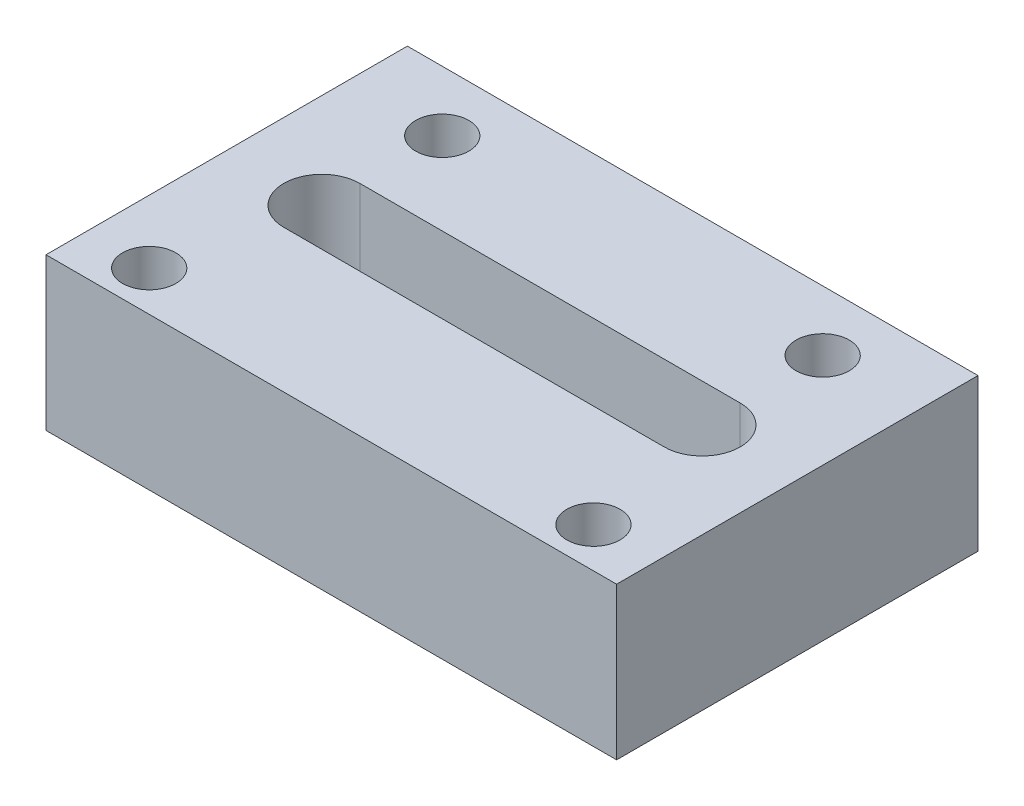
ISO-10303-21;
HEADER;
FILE_DESCRIPTION(('STEP AP214'),'2;1');
FILE_NAME('part.step','',(''),(''),'','','');
FILE_SCHEMA(('AUTOMOTIVE_DESIGN { 1 0 10303 214 1 1 1 1 }'));
ENDSEC;
DATA;
#1=APPLICATION_CONTEXT('core data for automotive mechanical design processes');
#2=APPLICATION_PROTOCOL_DEFINITION('international standard','automotive_design',2000,#1);
#3=PRODUCT_CONTEXT('',#1,'mechanical');
#4=PRODUCT('Part','Part','',(#3));
#5=PRODUCT_RELATED_PRODUCT_CATEGORY('part','',(#4));
#6=PRODUCT_DEFINITION_FORMATION('','',#4);
#7=PRODUCT_DEFINITION_CONTEXT('part definition',#1,'design');
#8=PRODUCT_DEFINITION('design','',#6,#7);
#9=PRODUCT_DEFINITION_SHAPE('','',#8);
#10=(LENGTH_UNIT() NAMED_UNIT(*) SI_UNIT(.MILLI.,.METRE.));
#11=(NAMED_UNIT(*) PLANE_ANGLE_UNIT() SI_UNIT($,.RADIAN.));
#12=(NAMED_UNIT(*) SI_UNIT($,.STERADIAN.) SOLID_ANGLE_UNIT());
#13=UNCERTAINTY_MEASURE_WITH_UNIT(LENGTH_MEASURE(1.E-05),#10,'distance_accuracy_value','');
#14=(GEOMETRIC_REPRESENTATION_CONTEXT(3) GLOBAL_UNCERTAINTY_ASSIGNED_CONTEXT((#13)) GLOBAL_UNIT_ASSIGNED_CONTEXT((#10,
#11,#12)) REPRESENTATION_CONTEXT('',''));
#15=CARTESIAN_POINT('',(0.,0.,0.));
#16=DIRECTION('',(0.,0.,1.));
#17=DIRECTION('',(1.,0.,0.));
#18=AXIS2_PLACEMENT_3D('',#15,#16,#17);
#19=CARTESIAN_POINT('',(75.,-10.,-47.5));
#20=DIRECTION('',(1.,0.,0.));
#21=DIRECTION('',(0.,0.,-1.));
#22=AXIS2_PLACEMENT_3D('',#19,#20,#21);
#23=PLANE('',#22);
#24=DIRECTION('',(0.,1.,0.));
#25=VECTOR('',#24,1.);
#26=CARTESIAN_POINT('',(75.,-10.,-47.5));
#27=LINE('',#26,#25);
#28=CARTESIAN_POINT('',(75.,-10.,-47.5));
#29=VERTEX_POINT('',#28);
#30=CARTESIAN_POINT('',(75.,30.,-47.5));
#31=VERTEX_POINT('',#30);
#32=EDGE_CURVE('E36',#29,#31,#27,.T.);
#33=ORIENTED_EDGE('',*,*,#32,.T.);
#34=DIRECTION('',(0.,0.,-1.));
#35=VECTOR('',#34,1.);
#36=CARTESIAN_POINT('',(75.,30.,-47.5));
#37=LINE('',#36,#35);
#38=CARTESIAN_POINT('',(75.,30.,47.5));
#39=VERTEX_POINT('',#38);
#40=EDGE_CURVE('E131',#39,#31,#37,.T.);
#41=ORIENTED_EDGE('',*,*,#40,.F.);
#42=DIRECTION('',(0.,1.,0.));
#43=VECTOR('',#42,1.);
#44=CARTESIAN_POINT('',(75.,-10.,47.5));
#45=LINE('',#44,#43);
#46=CARTESIAN_POINT('',(75.,-10.,47.5));
#47=VERTEX_POINT('',#46);
#48=EDGE_CURVE('E11',#47,#39,#45,.T.);
#49=ORIENTED_EDGE('',*,*,#48,.F.);
#50=DIRECTION('',(0.,0.,-1.));
#51=VECTOR('',#50,1.);
#52=CARTESIAN_POINT('',(75.,-10.,-47.5));
#53=LINE('',#52,#51);
#54=EDGE_CURVE('E162',#47,#29,#53,.T.);
#55=ORIENTED_EDGE('',*,*,#54,.T.);
#56=EDGE_LOOP('',(#33,#41,#49,#55));
#57=FACE_BOUND('',#56,.T.);
#58=ADVANCED_FACE('F33',(#57),#23,.T.);
#59=CARTESIAN_POINT('',(-75.,-10.,47.5));
#60=DIRECTION('',(0.,0.,1.));
#61=DIRECTION('',(1.,0.,0.));
#62=AXIS2_PLACEMENT_3D('',#59,#60,#61);
#63=PLANE('',#62);
#64=ORIENTED_EDGE('',*,*,#48,.T.);
#65=DIRECTION('',(1.,0.,0.));
#66=VECTOR('',#65,1.);
#67=CARTESIAN_POINT('',(-75.,30.,47.5));
#68=LINE('',#67,#66);
#69=CARTESIAN_POINT('',(-75.,30.,47.5));
#70=VERTEX_POINT('',#69);
#71=EDGE_CURVE('E140',#70,#39,#68,.T.);
#72=ORIENTED_EDGE('',*,*,#71,.F.);
#73=DIRECTION('',(0.,1.,0.));
#74=VECTOR('',#73,1.);
#75=CARTESIAN_POINT('',(-75.,-10.,47.5));
#76=LINE('',#75,#74);
#77=CARTESIAN_POINT('',(-75.,-10.,47.5));
#78=VERTEX_POINT('',#77);
#79=EDGE_CURVE('E41',#78,#70,#76,.T.);
#80=ORIENTED_EDGE('',*,*,#79,.F.);
#81=DIRECTION('',(1.,0.,0.));
#82=VECTOR('',#81,1.);
#83=CARTESIAN_POINT('',(-75.,-10.,47.5));
#84=LINE('',#83,#82);
#85=EDGE_CURVE('E173',#78,#47,#84,.T.);
#86=ORIENTED_EDGE('',*,*,#85,.T.);
#87=EDGE_LOOP('',(#64,#72,#80,#86));
#88=FACE_BOUND('',#87,.T.);
#89=ADVANCED_FACE('F185',(#88),#63,.T.);
#90=CARTESIAN_POINT('',(-75.,-10.,-47.5));
#91=DIRECTION('',(-1.,0.,0.));
#92=DIRECTION('',(0.,0.,1.));
#93=AXIS2_PLACEMENT_3D('',#90,#91,#92);
#94=PLANE('',#93);
#95=ORIENTED_EDGE('',*,*,#79,.T.);
#96=DIRECTION('',(0.,0.,1.));
#97=VECTOR('',#96,1.);
#98=CARTESIAN_POINT('',(-75.,30.,-47.5));
#99=LINE('',#98,#97);
#100=CARTESIAN_POINT('',(-75.,30.,-47.5));
#101=VERTEX_POINT('',#100);
#102=EDGE_CURVE('E137',#101,#70,#99,.T.);
#103=ORIENTED_EDGE('',*,*,#102,.F.);
#104=DIRECTION('',(0.,1.,0.));
#105=VECTOR('',#104,1.);
#106=CARTESIAN_POINT('',(-75.,-10.,-47.5));
#107=LINE('',#106,#105);
#108=CARTESIAN_POINT('',(-75.,-10.,-47.5));
#109=VERTEX_POINT('',#108);
#110=EDGE_CURVE('E176',#109,#101,#107,.T.);
#111=ORIENTED_EDGE('',*,*,#110,.F.);
#112=DIRECTION('',(0.,0.,1.));
#113=VECTOR('',#112,1.);
#114=CARTESIAN_POINT('',(-75.,-10.,-47.5));
#115=LINE('',#114,#113);
#116=EDGE_CURVE('E170',#109,#78,#115,.T.);
#117=ORIENTED_EDGE('',*,*,#116,.T.);
#118=EDGE_LOOP('',(#95,#103,#111,#117));
#119=FACE_BOUND('',#118,.T.);
#120=ADVANCED_FACE('F191',(#119),#94,.T.);
#121=CARTESIAN_POINT('',(-75.,-10.,-47.5));
#122=DIRECTION('',(0.,0.,-1.));
#123=DIRECTION('',(-1.,0.,0.));
#124=AXIS2_PLACEMENT_3D('',#121,#122,#123);
#125=PLANE('',#124);
#126=ORIENTED_EDGE('',*,*,#110,.T.);
#127=DIRECTION('',(-1.,0.,0.));
#128=VECTOR('',#127,1.);
#129=CARTESIAN_POINT('',(-75.,30.,-47.5));
#130=LINE('',#129,#128);
#131=EDGE_CURVE('E134',#31,#101,#130,.T.);
#132=ORIENTED_EDGE('',*,*,#131,.F.);
#133=ORIENTED_EDGE('',*,*,#32,.F.);
#134=DIRECTION('',(-1.,0.,0.));
#135=VECTOR('',#134,1.);
#136=CARTESIAN_POINT('',(-75.,-10.,-47.5));
#137=LINE('',#136,#135);
#138=EDGE_CURVE('E167',#29,#109,#137,.T.);
#139=ORIENTED_EDGE('',*,*,#138,.T.);
#140=EDGE_LOOP('',(#126,#132,#133,#139));
#141=FACE_BOUND('',#140,.T.);
#142=ADVANCED_FACE('F180',(#141),#125,.T.);
#143=CARTESIAN_POINT('',(0.,-10.,0.));
#144=DIRECTION('',(0.,1.,0.));
#145=DIRECTION('',(0.,0.,1.));
#146=AXIS2_PLACEMENT_3D('',#143,#144,#145);
#147=PLANE('',#146);
#148=CARTESIAN_POINT('',(58.3891044371405,-10.,36.9797661435222));
#149=DIRECTION('',(0.,1.,0.));
#150=DIRECTION('',(0.,0.,1.));
#151=AXIS2_PLACEMENT_3D('',#148,#149,#150);
#152=CIRCLE('',#151,6.99999999999999);
#153=CARTESIAN_POINT('',(58.3891044371405,-10.,43.9797661435222));
#154=VERTEX_POINT('',#153);
#155=EDGE_CURVE('E143',#154,#154,#152,.T.);
#156=ORIENTED_EDGE('',*,*,#155,.T.);
#157=EDGE_LOOP('',(#156));
#158=FACE_BOUND('',#157,.T.);
#159=CARTESIAN_POINT('',(-58.3891044371403,-10.,36.9797661435222));
#160=DIRECTION('',(0.,1.,0.));
#161=DIRECTION('',(0.,0.,1.));
#162=AXIS2_PLACEMENT_3D('',#159,#160,#161);
#163=CIRCLE('',#162,7.);
#164=CARTESIAN_POINT('',(-58.3891044371403,-10.,43.9797661435222));
#165=VERTEX_POINT('',#164);
#166=EDGE_CURVE('E146',#165,#165,#163,.T.);
#167=ORIENTED_EDGE('',*,*,#166,.T.);
#168=EDGE_LOOP('',(#167));
#169=FACE_BOUND('',#168,.T.);
#170=CARTESIAN_POINT('',(50.,-10.,-31.6666666666667));
#171=DIRECTION('',(0.,1.,0.));
#172=DIRECTION('',(0.,0.,1.));
#173=AXIS2_PLACEMENT_3D('',#170,#171,#172);
#174=CIRCLE('',#173,7.);
#175=CARTESIAN_POINT('',(50.,-10.,-24.6666666666667));
#176=VERTEX_POINT('',#175);
#177=EDGE_CURVE('E149',#176,#176,#174,.T.);
#178=ORIENTED_EDGE('',*,*,#177,.T.);
#179=EDGE_LOOP('',(#178));
#180=FACE_BOUND('',#179,.T.);
#181=CARTESIAN_POINT('',(-50.,-10.,-31.6666666666667));
#182=DIRECTION('',(0.,1.,0.));
#183=DIRECTION('',(0.,0.,1.));
#184=AXIS2_PLACEMENT_3D('',#181,#182,#183);
#185=CIRCLE('',#184,7.);
#186=CARTESIAN_POINT('',(-50.,-10.,-24.6666666666667));
#187=VERTEX_POINT('',#186);
#188=EDGE_CURVE('E152',#187,#187,#185,.T.);
#189=ORIENTED_EDGE('',*,*,#188,.T.);
#190=EDGE_LOOP('',(#189));
#191=FACE_BOUND('',#190,.T.);
#192=DIRECTION('',(-1.,0.,0.));
#193=VECTOR('',#192,1.);
#194=CARTESIAN_POINT('',(-50.,-10.,-10.));
#195=LINE('',#194,#193);
#196=CARTESIAN_POINT('',(50.,-10.,-10.));
#197=VERTEX_POINT('',#196);
#198=CARTESIAN_POINT('',(-50.,-10.,-10.));
#199=VERTEX_POINT('',#198);
#200=EDGE_CURVE('E110',#197,#199,#195,.T.);
#201=ORIENTED_EDGE('',*,*,#200,.T.);
#202=CARTESIAN_POINT('',(-50.,-10.,0.));
#203=DIRECTION('',(0.,1.,0.));
#204=DIRECTION('',(0.,0.,1.));
#205=AXIS2_PLACEMENT_3D('',#202,#203,#204);
#206=CIRCLE('',#205,10.);
#207=CARTESIAN_POINT('',(-50.,-10.,10.));
#208=VERTEX_POINT('',#207);
#209=EDGE_CURVE('E155',#199,#208,#206,.T.);
#210=ORIENTED_EDGE('',*,*,#209,.T.);
#211=DIRECTION('',(1.,0.,0.));
#212=VECTOR('',#211,1.);
#213=CARTESIAN_POINT('',(-50.,-10.,10.));
#214=LINE('',#213,#212);
#215=CARTESIAN_POINT('',(50.,-10.,10.));
#216=VERTEX_POINT('',#215);
#217=EDGE_CURVE('E105',#208,#216,#214,.T.);
#218=ORIENTED_EDGE('',*,*,#217,.T.);
#219=CARTESIAN_POINT('',(50.,-10.,0.));
#220=DIRECTION('',(0.,1.,0.));
#221=DIRECTION('',(0.,0.,1.));
#222=AXIS2_PLACEMENT_3D('',#219,#220,#221);
#223=CIRCLE('',#222,10.);
#224=EDGE_CURVE('E49',#216,#197,#223,.T.);
#225=ORIENTED_EDGE('',*,*,#224,.T.);
#226=EDGE_LOOP('',(#201,#210,#218,#225));
#227=FACE_BOUND('',#226,.T.);
#228=ORIENTED_EDGE('',*,*,#54,.F.);
#229=ORIENTED_EDGE('',*,*,#85,.F.);
#230=ORIENTED_EDGE('',*,*,#116,.F.);
#231=ORIENTED_EDGE('',*,*,#138,.F.);
#232=EDGE_LOOP('',(#228,#229,#230,#231));
#233=FACE_BOUND('',#232,.T.);
#234=ADVANCED_FACE('F189',(#158,#169,#180,#191,#227,#233),#147,.F.);
#235=CARTESIAN_POINT('',(-50.,-10.,0.));
#236=DIRECTION('',(0.,1.,0.));
#237=DIRECTION('',(0.,0.,1.));
#238=AXIS2_PLACEMENT_3D('',#235,#236,#237);
#239=CYLINDRICAL_SURFACE('',#238,10.);
#240=DIRECTION('',(0.,1.,0.));
#241=VECTOR('',#240,1.);
#242=CARTESIAN_POINT('',(-50.,-10.,-10.));
#243=LINE('',#242,#241);
#244=CARTESIAN_POINT('',(-50.,30.,-10.));
#245=VERTEX_POINT('',#244);
#246=EDGE_CURVE('E115',#199,#245,#243,.T.);
#247=ORIENTED_EDGE('',*,*,#246,.T.);
#248=CARTESIAN_POINT('',(-50.,30.,0.));
#249=DIRECTION('',(0.,1.,0.));
#250=DIRECTION('',(0.,0.,1.));
#251=AXIS2_PLACEMENT_3D('',#248,#249,#250);
#252=CIRCLE('',#251,10.);
#253=CARTESIAN_POINT('',(-50.,30.,10.));
#254=VERTEX_POINT('',#253);
#255=EDGE_CURVE('E113',#245,#254,#252,.T.);
#256=ORIENTED_EDGE('',*,*,#255,.T.);
#257=DIRECTION('',(0.,1.,0.));
#258=VECTOR('',#257,1.);
#259=CARTESIAN_POINT('',(-50.,-10.,10.));
#260=LINE('',#259,#258);
#261=EDGE_CURVE('E98',#208,#254,#260,.T.);
#262=ORIENTED_EDGE('',*,*,#261,.F.);
#263=ORIENTED_EDGE('',*,*,#209,.F.);
#264=EDGE_LOOP('',(#247,#256,#262,#263));
#265=FACE_BOUND('',#264,.T.);
#266=ADVANCED_FACE('F114',(#265),#239,.F.);
#267=CARTESIAN_POINT('',(-50.,-10.,-10.));
#268=DIRECTION('',(0.,0.,-1.));
#269=DIRECTION('',(-1.,0.,0.));
#270=AXIS2_PLACEMENT_3D('',#267,#268,#269);
#271=PLANE('',#270);
#272=DIRECTION('',(0.,1.,0.));
#273=VECTOR('',#272,1.);
#274=CARTESIAN_POINT('',(50.,-10.,-10.));
#275=LINE('',#274,#273);
#276=CARTESIAN_POINT('',(50.,30.,-10.));
#277=VERTEX_POINT('',#276);
#278=EDGE_CURVE('E163',#197,#277,#275,.T.);
#279=ORIENTED_EDGE('',*,*,#278,.T.);
#280=DIRECTION('',(-1.,0.,0.));
#281=VECTOR('',#280,1.);
#282=CARTESIAN_POINT('',(-50.,30.,-10.));
#283=LINE('',#282,#281);
#284=EDGE_CURVE('E126',#277,#245,#283,.T.);
#285=ORIENTED_EDGE('',*,*,#284,.T.);
#286=ORIENTED_EDGE('',*,*,#246,.F.);
#287=ORIENTED_EDGE('',*,*,#200,.F.);
#288=EDGE_LOOP('',(#279,#285,#286,#287));
#289=FACE_BOUND('',#288,.T.);
#290=ADVANCED_FACE('F234',(#289),#271,.F.);
#291=CARTESIAN_POINT('',(50.,-10.,0.));
#292=DIRECTION('',(0.,1.,0.));
#293=DIRECTION('',(0.,0.,1.));
#294=AXIS2_PLACEMENT_3D('',#291,#292,#293);
#295=CYLINDRICAL_SURFACE('',#294,10.);
#296=DIRECTION('',(0.,1.,0.));
#297=VECTOR('',#296,1.);
#298=CARTESIAN_POINT('',(50.,-10.,10.));
#299=LINE('',#298,#297);
#300=CARTESIAN_POINT('',(50.,30.,10.));
#301=VERTEX_POINT('',#300);
#302=EDGE_CURVE('E109',#216,#301,#299,.T.);
#303=ORIENTED_EDGE('',*,*,#302,.T.);
#304=CARTESIAN_POINT('',(50.,30.,0.));
#305=DIRECTION('',(0.,1.,0.));
#306=DIRECTION('',(0.,0.,1.));
#307=AXIS2_PLACEMENT_3D('',#304,#305,#306);
#308=CIRCLE('',#307,10.);
#309=EDGE_CURVE('E124',#301,#277,#308,.T.);
#310=ORIENTED_EDGE('',*,*,#309,.T.);
#311=ORIENTED_EDGE('',*,*,#278,.F.);
#312=ORIENTED_EDGE('',*,*,#224,.F.);
#313=EDGE_LOOP('',(#303,#310,#311,#312));
#314=FACE_BOUND('',#313,.T.);
#315=ADVANCED_FACE('F243',(#314),#295,.F.);
#316=CARTESIAN_POINT('',(-50.,-10.,10.));
#317=DIRECTION('',(0.,0.,1.));
#318=DIRECTION('',(1.,0.,0.));
#319=AXIS2_PLACEMENT_3D('',#316,#317,#318);
#320=PLANE('',#319);
#321=ORIENTED_EDGE('',*,*,#261,.T.);
#322=DIRECTION('',(1.,0.,0.));
#323=VECTOR('',#322,1.);
#324=CARTESIAN_POINT('',(-50.,30.,10.));
#325=LINE('',#324,#323);
#326=EDGE_CURVE('E102',#254,#301,#325,.T.);
#327=ORIENTED_EDGE('',*,*,#326,.T.);
#328=ORIENTED_EDGE('',*,*,#302,.F.);
#329=ORIENTED_EDGE('',*,*,#217,.F.);
#330=EDGE_LOOP('',(#321,#327,#328,#329));
#331=FACE_BOUND('',#330,.T.);
#332=ADVANCED_FACE('F100',(#331),#320,.F.);
#333=CARTESIAN_POINT('',(-50.,-10.,-31.6666666666667));
#334=DIRECTION('',(0.,1.,0.));
#335=DIRECTION('',(0.,0.,1.));
#336=AXIS2_PLACEMENT_3D('',#333,#334,#335);
#337=CYLINDRICAL_SURFACE('',#336,7.);
#338=ORIENTED_EDGE('',*,*,#188,.F.);
#339=EDGE_LOOP('',(#338));
#340=FACE_BOUND('',#339,.T.);
#341=CARTESIAN_POINT('',(-50.,30.,-31.6666666666667));
#342=DIRECTION('',(0.,1.,0.));
#343=DIRECTION('',(0.,0.,1.));
#344=AXIS2_PLACEMENT_3D('',#341,#342,#343);
#345=CIRCLE('',#344,7.);
#346=CARTESIAN_POINT('',(-50.,30.,-24.6666666666667));
#347=VERTEX_POINT('',#346);
#348=EDGE_CURVE('E119',#347,#347,#345,.T.);
#349=ORIENTED_EDGE('',*,*,#348,.T.);
#350=EDGE_LOOP('',(#349));
#351=FACE_BOUND('',#350,.T.);
#352=ADVANCED_FACE('F261',(#340,#351),#337,.F.);
#353=CARTESIAN_POINT('',(50.,-10.,-31.6666666666667));
#354=DIRECTION('',(0.,1.,0.));
#355=DIRECTION('',(0.,0.,1.));
#356=AXIS2_PLACEMENT_3D('',#353,#354,#355);
#357=CYLINDRICAL_SURFACE('',#356,7.);
#358=ORIENTED_EDGE('',*,*,#177,.F.);
#359=EDGE_LOOP('',(#358));
#360=FACE_BOUND('',#359,.T.);
#361=CARTESIAN_POINT('',(50.,30.,-31.6666666666667));
#362=DIRECTION('',(0.,1.,0.));
#363=DIRECTION('',(0.,0.,1.));
#364=AXIS2_PLACEMENT_3D('',#361,#362,#363);
#365=CIRCLE('',#364,7.);
#366=CARTESIAN_POINT('',(50.,30.,-24.6666666666667));
#367=VERTEX_POINT('',#366);
#368=EDGE_CURVE('E320',#367,#367,#365,.T.);
#369=ORIENTED_EDGE('',*,*,#368,.T.);
#370=EDGE_LOOP('',(#369));
#371=FACE_BOUND('',#370,.T.);
#372=ADVANCED_FACE('F270',(#360,#371),#357,.F.);
#373=CARTESIAN_POINT('',(-58.3891044371403,-10.,36.9797661435222));
#374=DIRECTION('',(0.,1.,0.));
#375=DIRECTION('',(0.,0.,1.));
#376=AXIS2_PLACEMENT_3D('',#373,#374,#375);
#377=CYLINDRICAL_SURFACE('',#376,7.);
#378=ORIENTED_EDGE('',*,*,#166,.F.);
#379=EDGE_LOOP('',(#378));
#380=FACE_BOUND('',#379,.T.);
#381=CARTESIAN_POINT('',(-58.3891044371403,30.,36.9797661435222));
#382=DIRECTION('',(0.,1.,0.));
#383=DIRECTION('',(0.,0.,1.));
#384=AXIS2_PLACEMENT_3D('',#381,#382,#383);
#385=CIRCLE('',#384,7.);
#386=CARTESIAN_POINT('',(-58.3891044371403,30.,43.9797661435222));
#387=VERTEX_POINT('',#386);
#388=EDGE_CURVE('E316',#387,#387,#385,.T.);
#389=ORIENTED_EDGE('',*,*,#388,.T.);
#390=EDGE_LOOP('',(#389));
#391=FACE_BOUND('',#390,.T.);
#392=ADVANCED_FACE('F280',(#380,#391),#377,.F.);
#393=CARTESIAN_POINT('',(58.3891044371405,-10.,36.9797661435222));
#394=DIRECTION('',(0.,1.,0.));
#395=DIRECTION('',(0.,0.,1.));
#396=AXIS2_PLACEMENT_3D('',#393,#394,#395);
#397=CYLINDRICAL_SURFACE('',#396,6.99999999999999);
#398=ORIENTED_EDGE('',*,*,#155,.F.);
#399=EDGE_LOOP('',(#398));
#400=FACE_BOUND('',#399,.T.);
#401=CARTESIAN_POINT('',(58.3891044371405,30.,36.9797661435222));
#402=DIRECTION('',(0.,1.,0.));
#403=DIRECTION('',(0.,0.,1.));
#404=AXIS2_PLACEMENT_3D('',#401,#402,#403);
#405=CIRCLE('',#404,6.99999999999999);
#406=CARTESIAN_POINT('',(58.3891044371405,30.,43.9797661435222));
#407=VERTEX_POINT('',#406);
#408=EDGE_CURVE('E325',#407,#407,#405,.T.);
#409=ORIENTED_EDGE('',*,*,#408,.T.);
#410=EDGE_LOOP('',(#409));
#411=FACE_BOUND('',#410,.T.);
#412=ADVANCED_FACE('F290',(#400,#411),#397,.F.);
#413=CARTESIAN_POINT('',(0.,30.,0.));
#414=DIRECTION('',(0.,1.,0.));
#415=DIRECTION('',(0.,0.,1.));
#416=AXIS2_PLACEMENT_3D('',#413,#414,#415);
#417=PLANE('',#416);
#418=ORIENTED_EDGE('',*,*,#388,.F.);
#419=EDGE_LOOP('',(#418));
#420=FACE_BOUND('',#419,.T.);
#421=ORIENTED_EDGE('',*,*,#348,.F.);
#422=EDGE_LOOP('',(#421));
#423=FACE_BOUND('',#422,.T.);
#424=ORIENTED_EDGE('',*,*,#40,.T.);
#425=ORIENTED_EDGE('',*,*,#131,.T.);
#426=ORIENTED_EDGE('',*,*,#102,.T.);
#427=ORIENTED_EDGE('',*,*,#71,.T.);
#428=EDGE_LOOP('',(#424,#425,#426,#427));
#429=FACE_BOUND('',#428,.T.);
#430=ORIENTED_EDGE('',*,*,#326,.F.);
#431=ORIENTED_EDGE('',*,*,#255,.F.);
#432=ORIENTED_EDGE('',*,*,#284,.F.);
#433=ORIENTED_EDGE('',*,*,#309,.F.);
#434=EDGE_LOOP('',(#430,#431,#432,#433));
#435=FACE_BOUND('',#434,.T.);
#436=ORIENTED_EDGE('',*,*,#368,.F.);
#437=EDGE_LOOP('',(#436));
#438=FACE_BOUND('',#437,.T.);
#439=ORIENTED_EDGE('',*,*,#408,.F.);
#440=EDGE_LOOP('',(#439));
#441=FACE_BOUND('',#440,.T.);
#442=ADVANCED_FACE('F121',(#420,#423,#429,#435,#438,#441),#417,.T.);
#443=CLOSED_SHELL('',(#58,#89,#120,#142,#234,#266,#290,#315,#332,#352,#372,#392,#412,#442));
#444=MANIFOLD_SOLID_BREP('B2',#443);
#445=ADVANCED_BREP_SHAPE_REPRESENTATION('',(#18,#444),#14);
#446=SHAPE_DEFINITION_REPRESENTATION(#9,#445);
ENDSEC;
END-ISO-10303-21;
